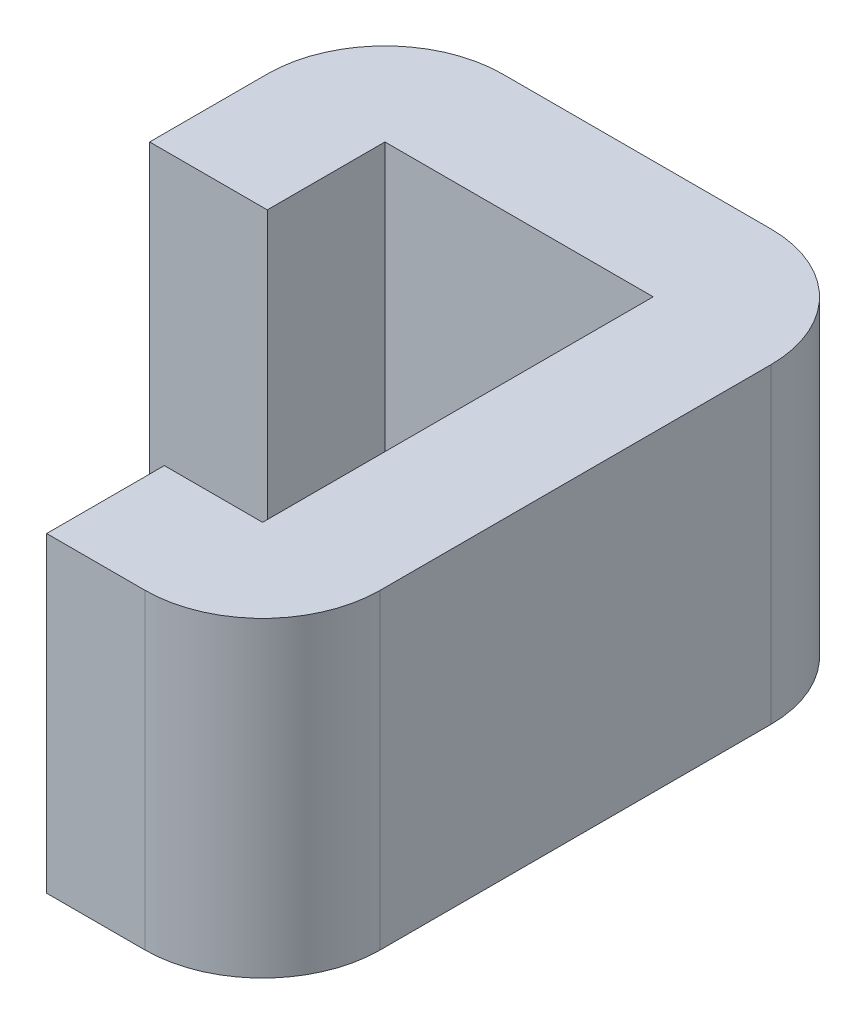
ISO-10303-21;
HEADER;
FILE_DESCRIPTION(('STEP AP214'),'2;1');
FILE_NAME('part.step','',(''),(''),'','','');
FILE_SCHEMA(('AUTOMOTIVE_DESIGN { 1 0 10303 214 1 1 1 1 }'));
ENDSEC;
DATA;
#1=APPLICATION_CONTEXT('core data for automotive mechanical design processes');
#2=APPLICATION_PROTOCOL_DEFINITION('international standard','automotive_design',2000,#1);
#3=PRODUCT_CONTEXT('',#1,'mechanical');
#4=PRODUCT('Part','Part','',(#3));
#5=PRODUCT_RELATED_PRODUCT_CATEGORY('part','',(#4));
#6=PRODUCT_DEFINITION_FORMATION('','',#4);
#7=PRODUCT_DEFINITION_CONTEXT('part definition',#1,'design');
#8=PRODUCT_DEFINITION('design','',#6,#7);
#9=PRODUCT_DEFINITION_SHAPE('','',#8);
#10=(LENGTH_UNIT() NAMED_UNIT(*) SI_UNIT(.MILLI.,.METRE.));
#11=(NAMED_UNIT(*) PLANE_ANGLE_UNIT() SI_UNIT($,.RADIAN.));
#12=(NAMED_UNIT(*) SI_UNIT($,.STERADIAN.) SOLID_ANGLE_UNIT());
#13=UNCERTAINTY_MEASURE_WITH_UNIT(LENGTH_MEASURE(1.E-05),#10,'distance_accuracy_value','');
#14=(GEOMETRIC_REPRESENTATION_CONTEXT(3) GLOBAL_UNCERTAINTY_ASSIGNED_CONTEXT((#13)) GLOBAL_UNIT_ASSIGNED_CONTEXT((#10,
#11,#12)) REPRESENTATION_CONTEXT('',''));
#15=CARTESIAN_POINT('',(0.,0.,0.));
#16=DIRECTION('',(0.,0.,1.));
#17=DIRECTION('',(1.,0.,0.));
#18=AXIS2_PLACEMENT_3D('',#15,#16,#17);
#19=CARTESIAN_POINT('',(-3.525,0.331,0.25));
#20=DIRECTION('',(0.,1.,0.));
#21=DIRECTION('',(0.,0.,1.));
#22=AXIS2_PLACEMENT_3D('',#19,#20,#21);
#23=PLANE('',#22);
#24=DIRECTION('',(0.,0.,1.));
#25=VECTOR('',#24,1.);
#26=CARTESIAN_POINT('',(-4.095,0.331,0.5));
#27=LINE('',#26,#25);
#28=CARTESIAN_POINT('',(-4.095,0.331,0.5));
#29=VERTEX_POINT('',#28);
#30=CARTESIAN_POINT('',(-4.095,0.331,0.25));
#31=VERTEX_POINT('',#30);
#32=EDGE_CURVE('E181',#29,#31,#27,.F.);
#33=ORIENTED_EDGE('',*,*,#32,.T.);
#34=DIRECTION('',(-1.,0.,0.));
#35=VECTOR('',#34,1.);
#36=CARTESIAN_POINT('',(-4.095,0.331,0.25));
#37=LINE('',#36,#35);
#38=CARTESIAN_POINT('',(-3.525,0.331,0.25));
#39=VERTEX_POINT('',#38);
#40=EDGE_CURVE('E168',#31,#39,#37,.F.);
#41=ORIENTED_EDGE('',*,*,#40,.T.);
#42=DIRECTION('',(0.,0.,-1.));
#43=VECTOR('',#42,1.);
#44=CARTESIAN_POINT('',(-3.525,0.331,0.25));
#45=LINE('',#44,#43);
#46=CARTESIAN_POINT('',(-3.525,0.331,1.08));
#47=VERTEX_POINT('',#46);
#48=EDGE_CURVE('E158',#39,#47,#45,.F.);
#49=ORIENTED_EDGE('',*,*,#48,.T.);
#50=DIRECTION('',(1.,0.,0.));
#51=VECTOR('',#50,1.);
#52=CARTESIAN_POINT('',(-3.525,0.331,1.08));
#53=LINE('',#52,#51);
#54=CARTESIAN_POINT('',(-3.7338,0.331,1.08));
#55=VERTEX_POINT('',#54);
#56=EDGE_CURVE('E147',#47,#55,#53,.F.);
#57=ORIENTED_EDGE('',*,*,#56,.T.);
#58=DIRECTION('',(0.,0.,-1.));
#59=VECTOR('',#58,1.);
#60=CARTESIAN_POINT('',(-3.7338,0.331,1.08));
#61=LINE('',#60,#59);
#62=CARTESIAN_POINT('',(-3.7338,0.331,1.33));
#63=VERTEX_POINT('',#62);
#64=EDGE_CURVE('E122',#55,#63,#61,.F.);
#65=ORIENTED_EDGE('',*,*,#64,.T.);
#66=DIRECTION('',(1.,0.,0.));
#67=VECTOR('',#66,1.);
#68=CARTESIAN_POINT('',(-3.525,0.331,1.33));
#69=LINE('',#68,#67);
#70=CARTESIAN_POINT('',(-3.525,0.331,1.33));
#71=VERTEX_POINT('',#70);
#72=EDGE_CURVE('E120',#71,#63,#69,.F.);
#73=ORIENTED_EDGE('',*,*,#72,.F.);
#74=CARTESIAN_POINT('',(-3.525,0.331,1.08));
#75=DIRECTION('',(0.,-1.,0.));
#76=DIRECTION('',(0.,0.,-1.));
#77=AXIS2_PLACEMENT_3D('',#74,#75,#76);
#78=CIRCLE('',#77,0.25);
#79=CARTESIAN_POINT('',(-3.275,0.331,1.08));
#80=VERTEX_POINT('',#79);
#81=EDGE_CURVE('E20',#80,#71,#78,.T.);
#82=ORIENTED_EDGE('',*,*,#81,.F.);
#83=DIRECTION('',(0.,0.,1.));
#84=VECTOR('',#83,1.);
#85=CARTESIAN_POINT('',(-3.275,0.331,1.08));
#86=LINE('',#85,#84);
#87=CARTESIAN_POINT('',(-3.275,0.331,0.25));
#88=VERTEX_POINT('',#87);
#89=EDGE_CURVE('E131',#80,#88,#86,.F.);
#90=ORIENTED_EDGE('',*,*,#89,.T.);
#91=CARTESIAN_POINT('',(-3.525,0.331,0.25));
#92=DIRECTION('',(0.,-1.,0.));
#93=DIRECTION('',(0.,0.,-1.));
#94=AXIS2_PLACEMENT_3D('',#91,#92,#93);
#95=CIRCLE('',#94,0.25);
#96=CARTESIAN_POINT('',(-3.525,0.331,0.));
#97=VERTEX_POINT('',#96);
#98=EDGE_CURVE('E212',#97,#88,#95,.T.);
#99=ORIENTED_EDGE('',*,*,#98,.F.);
#100=DIRECTION('',(1.,0.,0.));
#101=VECTOR('',#100,1.);
#102=CARTESIAN_POINT('',(-3.525,0.331,0.));
#103=LINE('',#102,#101);
#104=CARTESIAN_POINT('',(-4.095,0.331,0.));
#105=VERTEX_POINT('',#104);
#106=EDGE_CURVE('E207',#97,#105,#103,.F.);
#107=ORIENTED_EDGE('',*,*,#106,.T.);
#108=CARTESIAN_POINT('',(-4.095,0.331,0.25));
#109=DIRECTION('',(0.,-1.,0.));
#110=DIRECTION('',(0.,0.,-1.));
#111=AXIS2_PLACEMENT_3D('',#108,#109,#110);
#112=CIRCLE('',#111,0.25);
#113=CARTESIAN_POINT('',(-4.345,0.331,0.25));
#114=VERTEX_POINT('',#113);
#115=EDGE_CURVE('E210',#114,#105,#112,.T.);
#116=ORIENTED_EDGE('',*,*,#115,.F.);
#117=DIRECTION('',(0.,0.,-1.));
#118=VECTOR('',#117,1.);
#119=CARTESIAN_POINT('',(-4.345,0.331,0.25));
#120=LINE('',#119,#118);
#121=CARTESIAN_POINT('',(-4.345,0.331,0.5));
#122=VERTEX_POINT('',#121);
#123=EDGE_CURVE('E202',#114,#122,#120,.F.);
#124=ORIENTED_EDGE('',*,*,#123,.T.);
#125=DIRECTION('',(-1.,0.,0.));
#126=VECTOR('',#125,1.);
#127=CARTESIAN_POINT('',(-4.345,0.331,0.5));
#128=LINE('',#127,#126);
#129=EDGE_CURVE('E195',#122,#29,#128,.F.);
#130=ORIENTED_EDGE('',*,*,#129,.T.);
#131=EDGE_LOOP('',(#33,#41,#49,#57,#65,#73,#82,#90,#99,#107,#116,#124,#130));
#132=FACE_BOUND('',#131,.T.);
#133=ADVANCED_FACE('F17',(#132),#23,.T.);
#134=CARTESIAN_POINT('',(-3.525,-0.331,0.25));
#135=DIRECTION('',(1.,0.,0.));
#136=DIRECTION('',(0.,0.,-1.));
#137=AXIS2_PLACEMENT_3D('',#134,#135,#136);
#138=PLANE('',#137);
#139=DIRECTION('',(0.,1.,0.));
#140=VECTOR('',#139,1.);
#141=CARTESIAN_POINT('',(-3.525,-0.331,1.08));
#142=LINE('',#141,#140);
#143=CARTESIAN_POINT('',(-3.525,-0.331,1.08));
#144=VERTEX_POINT('',#143);
#145=EDGE_CURVE('E155',#144,#47,#142,.T.);
#146=ORIENTED_EDGE('',*,*,#145,.T.);
#147=ORIENTED_EDGE('',*,*,#48,.F.);
#148=DIRECTION('',(0.,1.,0.));
#149=VECTOR('',#148,1.);
#150=CARTESIAN_POINT('',(-3.525,-0.331,0.25));
#151=LINE('',#150,#149);
#152=CARTESIAN_POINT('',(-3.525,-0.331,0.25));
#153=VERTEX_POINT('',#152);
#154=EDGE_CURVE('E163',#39,#153,#151,.F.);
#155=ORIENTED_EDGE('',*,*,#154,.T.);
#156=DIRECTION('',(0.,0.,1.));
#157=VECTOR('',#156,1.);
#158=CARTESIAN_POINT('',(-3.525,-0.331,0.25));
#159=LINE('',#158,#157);
#160=EDGE_CURVE('E152',#153,#144,#159,.T.);
#161=ORIENTED_EDGE('',*,*,#160,.T.);
#162=EDGE_LOOP('',(#146,#147,#155,#161));
#163=FACE_BOUND('',#162,.T.);
#164=ADVANCED_FACE('F395',(#163),#138,.F.);
#165=CARTESIAN_POINT('',(-3.525,-0.331,1.08));
#166=DIRECTION('',(0.,0.,1.));
#167=DIRECTION('',(1.,0.,0.));
#168=AXIS2_PLACEMENT_3D('',#165,#166,#167);
#169=PLANE('',#168);
#170=DIRECTION('',(0.,1.,0.));
#171=VECTOR('',#170,1.);
#172=CARTESIAN_POINT('',(-3.7338,-0.331,1.08));
#173=LINE('',#172,#171);
#174=CARTESIAN_POINT('',(-3.7338,-0.331,1.08));
#175=VERTEX_POINT('',#174);
#176=EDGE_CURVE('E144',#175,#55,#173,.T.);
#177=ORIENTED_EDGE('',*,*,#176,.T.);
#178=ORIENTED_EDGE('',*,*,#56,.F.);
#179=ORIENTED_EDGE('',*,*,#145,.F.);
#180=DIRECTION('',(1.,0.,0.));
#181=VECTOR('',#180,1.);
#182=CARTESIAN_POINT('',(-3.525,-0.331,1.08));
#183=LINE('',#182,#181);
#184=EDGE_CURVE('E141',#144,#175,#183,.F.);
#185=ORIENTED_EDGE('',*,*,#184,.T.);
#186=EDGE_LOOP('',(#177,#178,#179,#185));
#187=FACE_BOUND('',#186,.T.);
#188=ADVANCED_FACE('F385',(#187),#169,.F.);
#189=CARTESIAN_POINT('',(-3.7338,-0.331,1.08));
#190=DIRECTION('',(1.,0.,0.));
#191=DIRECTION('',(0.,0.,-1.));
#192=AXIS2_PLACEMENT_3D('',#189,#190,#191);
#193=PLANE('',#192);
#194=DIRECTION('',(0.,1.,0.));
#195=VECTOR('',#194,1.);
#196=CARTESIAN_POINT('',(-3.7338,-0.331,1.33));
#197=LINE('',#196,#195);
#198=CARTESIAN_POINT('',(-3.7338,-0.331,1.33));
#199=VERTEX_POINT('',#198);
#200=EDGE_CURVE('E118',#63,#199,#197,.F.);
#201=ORIENTED_EDGE('',*,*,#200,.F.);
#202=ORIENTED_EDGE('',*,*,#64,.F.);
#203=ORIENTED_EDGE('',*,*,#176,.F.);
#204=DIRECTION('',(0.,0.,1.));
#205=VECTOR('',#204,1.);
#206=CARTESIAN_POINT('',(-3.7338,-0.331,0.25));
#207=LINE('',#206,#205);
#208=EDGE_CURVE('E138',#175,#199,#207,.T.);
#209=ORIENTED_EDGE('',*,*,#208,.T.);
#210=EDGE_LOOP('',(#201,#202,#203,#209));
#211=FACE_BOUND('',#210,.T.);
#212=ADVANCED_FACE('F376',(#211),#193,.F.);
#213=CARTESIAN_POINT('',(-3.525,-0.331,1.33));
#214=DIRECTION('',(0.,0.,1.));
#215=DIRECTION('',(1.,0.,0.));
#216=AXIS2_PLACEMENT_3D('',#213,#214,#215);
#217=PLANE('',#216);
#218=ORIENTED_EDGE('',*,*,#200,.T.);
#219=DIRECTION('',(1.,0.,0.));
#220=VECTOR('',#219,1.);
#221=CARTESIAN_POINT('',(-3.525,-0.331,1.33));
#222=LINE('',#221,#220);
#223=CARTESIAN_POINT('',(-3.525,-0.331,1.33));
#224=VERTEX_POINT('',#223);
#225=EDGE_CURVE('E129',#199,#224,#222,.T.);
#226=ORIENTED_EDGE('',*,*,#225,.T.);
#227=DIRECTION('',(0.,-1.,0.));
#228=VECTOR('',#227,1.);
#229=CARTESIAN_POINT('',(-3.525,-0.331,1.33));
#230=LINE('',#229,#228);
#231=EDGE_CURVE('E115',#71,#224,#230,.T.);
#232=ORIENTED_EDGE('',*,*,#231,.F.);
#233=ORIENTED_EDGE('',*,*,#72,.T.);
#234=EDGE_LOOP('',(#218,#226,#232,#233));
#235=FACE_BOUND('',#234,.T.);
#236=ADVANCED_FACE('F127',(#235),#217,.T.);
#237=CARTESIAN_POINT('',(-3.525,-0.331,1.08));
#238=DIRECTION('',(0.,-1.,0.));
#239=DIRECTION('',(0.,0.,-1.));
#240=AXIS2_PLACEMENT_3D('',#237,#238,#239);
#241=CYLINDRICAL_SURFACE('',#240,0.25);
#242=ORIENTED_EDGE('',*,*,#81,.T.);
#243=ORIENTED_EDGE('',*,*,#231,.T.);
#244=CARTESIAN_POINT('',(-3.525,-0.331,1.08));
#245=DIRECTION('',(0.,-1.,0.));
#246=DIRECTION('',(0.,0.,-1.));
#247=AXIS2_PLACEMENT_3D('',#244,#245,#246);
#248=CIRCLE('',#247,0.25);
#249=CARTESIAN_POINT('',(-3.275,-0.331,1.08));
#250=VERTEX_POINT('',#249);
#251=EDGE_CURVE('E231',#224,#250,#248,.F.);
#252=ORIENTED_EDGE('',*,*,#251,.T.);
#253=DIRECTION('',(0.,1.,0.));
#254=VECTOR('',#253,1.);
#255=CARTESIAN_POINT('',(-3.275,-0.331,1.08));
#256=LINE('',#255,#254);
#257=EDGE_CURVE('E117',#250,#80,#256,.T.);
#258=ORIENTED_EDGE('',*,*,#257,.T.);
#259=EDGE_LOOP('',(#242,#243,#252,#258));
#260=FACE_BOUND('',#259,.T.);
#261=ADVANCED_FACE('F112',(#260),#241,.T.);
#262=CARTESIAN_POINT('',(-3.275,-0.331,1.08));
#263=DIRECTION('',(-1.,0.,0.));
#264=DIRECTION('',(0.,0.,1.));
#265=AXIS2_PLACEMENT_3D('',#262,#263,#264);
#266=PLANE('',#265);
#267=DIRECTION('',(0.,-1.,0.));
#268=VECTOR('',#267,1.);
#269=CARTESIAN_POINT('',(-3.275,-0.331,0.25));
#270=LINE('',#269,#268);
#271=CARTESIAN_POINT('',(-3.275,-0.331,0.25));
#272=VERTEX_POINT('',#271);
#273=EDGE_CURVE('E234',#88,#272,#270,.T.);
#274=ORIENTED_EDGE('',*,*,#273,.F.);
#275=ORIENTED_EDGE('',*,*,#89,.F.);
#276=ORIENTED_EDGE('',*,*,#257,.F.);
#277=DIRECTION('',(0.,0.,1.));
#278=VECTOR('',#277,1.);
#279=CARTESIAN_POINT('',(-3.275,-0.331,0.25));
#280=LINE('',#279,#278);
#281=EDGE_CURVE('E230',#250,#272,#280,.F.);
#282=ORIENTED_EDGE('',*,*,#281,.T.);
#283=EDGE_LOOP('',(#274,#275,#276,#282));
#284=FACE_BOUND('',#283,.T.);
#285=ADVANCED_FACE('F281',(#284),#266,.F.);
#286=CARTESIAN_POINT('',(-3.525,-0.331,0.25));
#287=DIRECTION('',(0.,-1.,0.));
#288=DIRECTION('',(0.,0.,-1.));
#289=AXIS2_PLACEMENT_3D('',#286,#287,#288);
#290=CYLINDRICAL_SURFACE('',#289,0.25);
#291=ORIENTED_EDGE('',*,*,#98,.T.);
#292=ORIENTED_EDGE('',*,*,#273,.T.);
#293=CARTESIAN_POINT('',(-3.525,-0.331,0.25));
#294=DIRECTION('',(0.,-1.,0.));
#295=DIRECTION('',(0.,0.,-1.));
#296=AXIS2_PLACEMENT_3D('',#293,#294,#295);
#297=CIRCLE('',#296,0.25);
#298=CARTESIAN_POINT('',(-3.525,-0.331,0.));
#299=VERTEX_POINT('',#298);
#300=EDGE_CURVE('E227',#272,#299,#297,.F.);
#301=ORIENTED_EDGE('',*,*,#300,.T.);
#302=DIRECTION('',(0.,1.,0.));
#303=VECTOR('',#302,1.);
#304=CARTESIAN_POINT('',(-3.525,-0.331,0.));
#305=LINE('',#304,#303);
#306=EDGE_CURVE('E211',#299,#97,#305,.T.);
#307=ORIENTED_EDGE('',*,*,#306,.T.);
#308=EDGE_LOOP('',(#291,#292,#301,#307));
#309=FACE_BOUND('',#308,.T.);
#310=ADVANCED_FACE('F279',(#309),#290,.T.);
#311=CARTESIAN_POINT('',(-3.525,-0.331,0.));
#312=DIRECTION('',(0.,0.,1.));
#313=DIRECTION('',(1.,0.,0.));
#314=AXIS2_PLACEMENT_3D('',#311,#312,#313);
#315=PLANE('',#314);
#316=DIRECTION('',(0.,-1.,0.));
#317=VECTOR('',#316,1.);
#318=CARTESIAN_POINT('',(-4.095,-0.331,0.));
#319=LINE('',#318,#317);
#320=CARTESIAN_POINT('',(-4.095,-0.331,0.));
#321=VERTEX_POINT('',#320);
#322=EDGE_CURVE('E233',#105,#321,#319,.T.);
#323=ORIENTED_EDGE('',*,*,#322,.F.);
#324=ORIENTED_EDGE('',*,*,#106,.F.);
#325=ORIENTED_EDGE('',*,*,#306,.F.);
#326=DIRECTION('',(1.,0.,0.));
#327=VECTOR('',#326,1.);
#328=CARTESIAN_POINT('',(-3.525,-0.331,0.));
#329=LINE('',#328,#327);
#330=EDGE_CURVE('E226',#299,#321,#329,.F.);
#331=ORIENTED_EDGE('',*,*,#330,.T.);
#332=EDGE_LOOP('',(#323,#324,#325,#331));
#333=FACE_BOUND('',#332,.T.);
#334=ADVANCED_FACE('F277',(#333),#315,.F.);
#335=CARTESIAN_POINT('',(-4.095,-0.331,0.25));
#336=DIRECTION('',(0.,-1.,0.));
#337=DIRECTION('',(0.,0.,-1.));
#338=AXIS2_PLACEMENT_3D('',#335,#336,#337);
#339=CYLINDRICAL_SURFACE('',#338,0.25);
#340=ORIENTED_EDGE('',*,*,#115,.T.);
#341=ORIENTED_EDGE('',*,*,#322,.T.);
#342=CARTESIAN_POINT('',(-4.095,-0.331,0.25));
#343=DIRECTION('',(0.,-1.,0.));
#344=DIRECTION('',(0.,0.,-1.));
#345=AXIS2_PLACEMENT_3D('',#342,#343,#344);
#346=CIRCLE('',#345,0.25);
#347=CARTESIAN_POINT('',(-4.345,-0.331,0.25));
#348=VERTEX_POINT('',#347);
#349=EDGE_CURVE('E222',#321,#348,#346,.F.);
#350=ORIENTED_EDGE('',*,*,#349,.T.);
#351=DIRECTION('',(0.,1.,0.));
#352=VECTOR('',#351,1.);
#353=CARTESIAN_POINT('',(-4.345,-0.331,0.25));
#354=LINE('',#353,#352);
#355=EDGE_CURVE('E204',#348,#114,#354,.T.);
#356=ORIENTED_EDGE('',*,*,#355,.T.);
#357=EDGE_LOOP('',(#340,#341,#350,#356));
#358=FACE_BOUND('',#357,.T.);
#359=ADVANCED_FACE('F273',(#358),#339,.T.);
#360=CARTESIAN_POINT('',(-4.345,-0.331,0.25));
#361=DIRECTION('',(1.,0.,0.));
#362=DIRECTION('',(0.,0.,-1.));
#363=AXIS2_PLACEMENT_3D('',#360,#361,#362);
#364=PLANE('',#363);
#365=DIRECTION('',(0.,1.,0.));
#366=VECTOR('',#365,1.);
#367=CARTESIAN_POINT('',(-4.345,-0.331,0.5));
#368=LINE('',#367,#366);
#369=CARTESIAN_POINT('',(-4.345,-0.331,0.5));
#370=VERTEX_POINT('',#369);
#371=EDGE_CURVE('E199',#370,#122,#368,.T.);
#372=ORIENTED_EDGE('',*,*,#371,.T.);
#373=ORIENTED_EDGE('',*,*,#123,.F.);
#374=ORIENTED_EDGE('',*,*,#355,.F.);
#375=DIRECTION('',(0.,0.,1.));
#376=VECTOR('',#375,1.);
#377=CARTESIAN_POINT('',(-4.345,-0.331,0.25));
#378=LINE('',#377,#376);
#379=EDGE_CURVE('E225',#348,#370,#378,.T.);
#380=ORIENTED_EDGE('',*,*,#379,.T.);
#381=EDGE_LOOP('',(#372,#373,#374,#380));
#382=FACE_BOUND('',#381,.T.);
#383=ADVANCED_FACE('F264',(#382),#364,.F.);
#384=CARTESIAN_POINT('',(-4.345,-0.331,0.5));
#385=DIRECTION('',(0.,0.,-1.));
#386=DIRECTION('',(-1.,0.,0.));
#387=AXIS2_PLACEMENT_3D('',#384,#385,#386);
#388=PLANE('',#387);
#389=DIRECTION('',(0.,1.,0.));
#390=VECTOR('',#389,1.);
#391=CARTESIAN_POINT('',(-4.095,-0.331,0.5));
#392=LINE('',#391,#390);
#393=CARTESIAN_POINT('',(-4.095,-0.331,0.5));
#394=VERTEX_POINT('',#393);
#395=EDGE_CURVE('E185',#394,#29,#392,.T.);
#396=ORIENTED_EDGE('',*,*,#395,.T.);
#397=ORIENTED_EDGE('',*,*,#129,.F.);
#398=ORIENTED_EDGE('',*,*,#371,.F.);
#399=DIRECTION('',(1.,0.,0.));
#400=VECTOR('',#399,1.);
#401=CARTESIAN_POINT('',(-3.525,-0.331,0.5));
#402=LINE('',#401,#400);
#403=EDGE_CURVE('E190',#370,#394,#402,.T.);
#404=ORIENTED_EDGE('',*,*,#403,.T.);
#405=EDGE_LOOP('',(#396,#397,#398,#404));
#406=FACE_BOUND('',#405,.T.);
#407=ADVANCED_FACE('F304',(#406),#388,.F.);
#408=CARTESIAN_POINT('',(-4.095,-0.331,0.5));
#409=DIRECTION('',(-1.,0.,0.));
#410=DIRECTION('',(0.,0.,1.));
#411=AXIS2_PLACEMENT_3D('',#408,#409,#410);
#412=PLANE('',#411);
#413=DIRECTION('',(0.,1.,0.));
#414=VECTOR('',#413,1.);
#415=CARTESIAN_POINT('',(-4.095,-0.331,0.25));
#416=LINE('',#415,#414);
#417=CARTESIAN_POINT('',(-4.095,-0.331,0.25));
#418=VERTEX_POINT('',#417);
#419=EDGE_CURVE('E34',#418,#31,#416,.T.);
#420=ORIENTED_EDGE('',*,*,#419,.T.);
#421=ORIENTED_EDGE('',*,*,#32,.F.);
#422=ORIENTED_EDGE('',*,*,#395,.F.);
#423=DIRECTION('',(0.,0.,1.));
#424=VECTOR('',#423,1.);
#425=CARTESIAN_POINT('',(-4.095,-0.331,0.25));
#426=LINE('',#425,#424);
#427=EDGE_CURVE('E26',#394,#418,#426,.F.);
#428=ORIENTED_EDGE('',*,*,#427,.T.);
#429=EDGE_LOOP('',(#420,#421,#422,#428));
#430=FACE_BOUND('',#429,.T.);
#431=ADVANCED_FACE('F299',(#430),#412,.F.);
#432=CARTESIAN_POINT('',(-4.095,-0.331,0.25));
#433=DIRECTION('',(0.,0.,-1.));
#434=DIRECTION('',(-1.,0.,0.));
#435=AXIS2_PLACEMENT_3D('',#432,#433,#434);
#436=PLANE('',#435);
#437=ORIENTED_EDGE('',*,*,#154,.F.);
#438=ORIENTED_EDGE('',*,*,#40,.F.);
#439=ORIENTED_EDGE('',*,*,#419,.F.);
#440=DIRECTION('',(1.,0.,0.));
#441=VECTOR('',#440,1.);
#442=CARTESIAN_POINT('',(-3.525,-0.331,0.25));
#443=LINE('',#442,#441);
#444=EDGE_CURVE('E11',#418,#153,#443,.T.);
#445=ORIENTED_EDGE('',*,*,#444,.T.);
#446=EDGE_LOOP('',(#437,#438,#439,#445));
#447=FACE_BOUND('',#446,.T.);
#448=ADVANCED_FACE('F293',(#447),#436,.F.);
#449=CARTESIAN_POINT('',(-3.525,-0.331,0.25));
#450=DIRECTION('',(0.,1.,0.));
#451=DIRECTION('',(0.,0.,1.));
#452=AXIS2_PLACEMENT_3D('',#449,#450,#451);
#453=PLANE('',#452);
#454=ORIENTED_EDGE('',*,*,#427,.F.);
#455=ORIENTED_EDGE('',*,*,#403,.F.);
#456=ORIENTED_EDGE('',*,*,#379,.F.);
#457=ORIENTED_EDGE('',*,*,#349,.F.);
#458=ORIENTED_EDGE('',*,*,#330,.F.);
#459=ORIENTED_EDGE('',*,*,#300,.F.);
#460=ORIENTED_EDGE('',*,*,#281,.F.);
#461=ORIENTED_EDGE('',*,*,#251,.F.);
#462=ORIENTED_EDGE('',*,*,#225,.F.);
#463=ORIENTED_EDGE('',*,*,#208,.F.);
#464=ORIENTED_EDGE('',*,*,#184,.F.);
#465=ORIENTED_EDGE('',*,*,#160,.F.);
#466=ORIENTED_EDGE('',*,*,#444,.F.);
#467=EDGE_LOOP('',(#454,#455,#456,#457,#458,#459,#460,#461,#462,#463,#464,#465,#466));
#468=FACE_BOUND('',#467,.T.);
#469=ADVANCED_FACE('F270',(#468),#453,.F.);
#470=CLOSED_SHELL('',(#133,#164,#188,#212,#236,#261,#285,#310,#334,#359,#383,#407,#431,#448,#469));
#471=MANIFOLD_SOLID_BREP('B1',#470);
#472=ADVANCED_BREP_SHAPE_REPRESENTATION('',(#18,#471),#14);
#473=SHAPE_DEFINITION_REPRESENTATION(#9,#472);
ENDSEC;
END-ISO-10303-21;
